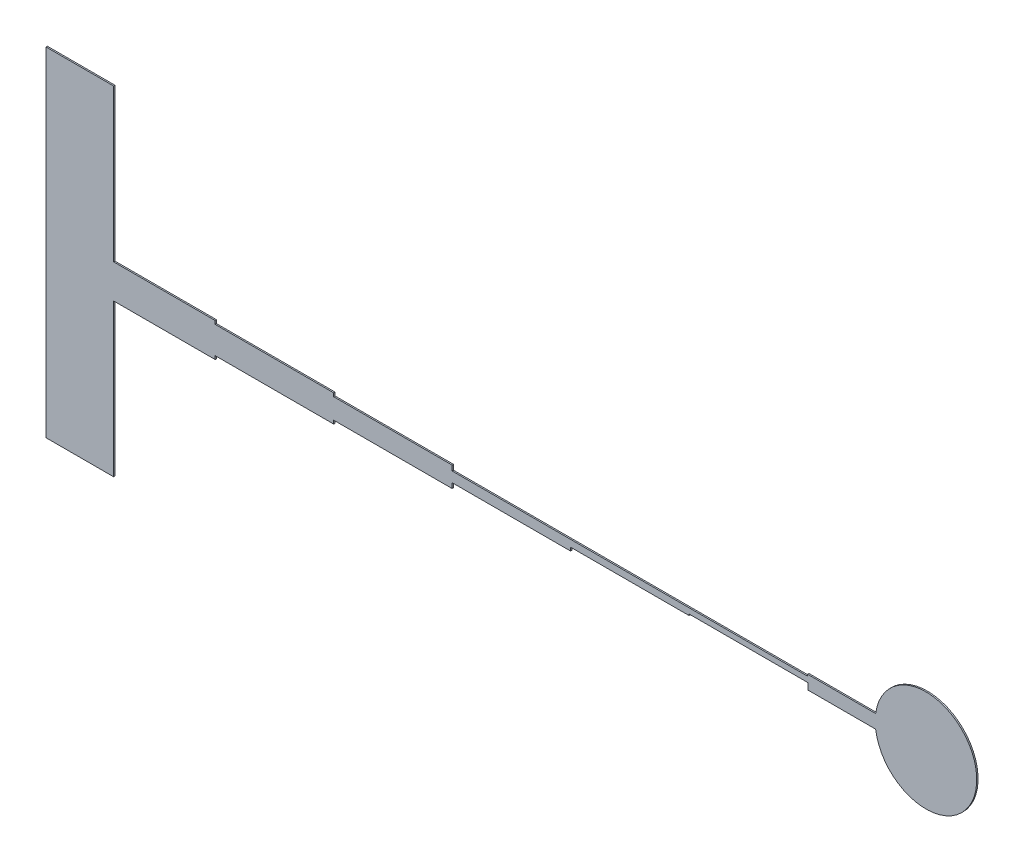
ISO-10303-21;
HEADER;
FILE_DESCRIPTION(('STEP AP214'),'2;1');
FILE_NAME('part.step','',(''),(''),'','','');
FILE_SCHEMA(('AUTOMOTIVE_DESIGN { 1 0 10303 214 1 1 1 1 }'));
ENDSEC;
DATA;
#1=APPLICATION_CONTEXT('core data for automotive mechanical design processes');
#2=APPLICATION_PROTOCOL_DEFINITION('international standard','automotive_design',2000,#1);
#3=PRODUCT_CONTEXT('',#1,'mechanical');
#4=PRODUCT('Part','Part','',(#3));
#5=PRODUCT_RELATED_PRODUCT_CATEGORY('part','',(#4));
#6=PRODUCT_DEFINITION_FORMATION('','',#4);
#7=PRODUCT_DEFINITION_CONTEXT('part definition',#1,'design');
#8=PRODUCT_DEFINITION('design','',#6,#7);
#9=PRODUCT_DEFINITION_SHAPE('','',#8);
#10=(LENGTH_UNIT() NAMED_UNIT(*) SI_UNIT(.MILLI.,.METRE.));
#11=(NAMED_UNIT(*) PLANE_ANGLE_UNIT() SI_UNIT($,.RADIAN.));
#12=(NAMED_UNIT(*) SI_UNIT($,.STERADIAN.) SOLID_ANGLE_UNIT());
#13=UNCERTAINTY_MEASURE_WITH_UNIT(LENGTH_MEASURE(1.E-05),#10,'distance_accuracy_value','');
#14=(GEOMETRIC_REPRESENTATION_CONTEXT(3) GLOBAL_UNCERTAINTY_ASSIGNED_CONTEXT((#13)) GLOBAL_UNIT_ASSIGNED_CONTEXT((#10,
#11,#12)) REPRESENTATION_CONTEXT('',''));
#15=CARTESIAN_POINT('',(0.,0.,0.));
#16=DIRECTION('',(0.,0.,1.));
#17=DIRECTION('',(1.,0.,0.));
#18=AXIS2_PLACEMENT_3D('',#15,#16,#17);
#19=CARTESIAN_POINT('',(12000.,2.44249065417534E-12,-20.));
#20=DIRECTION('',(0.,0.,1.));
#21=DIRECTION('',(1.,0.,0.));
#22=AXIS2_PLACEMENT_3D('',#19,#20,#21);
#23=PLANE('',#22);
#24=DIRECTION('',(-1.,0.,0.));
#25=VECTOR('',#24,1.);
#26=CARTESIAN_POINT('',(8500.,-4.99999999999992,-20.));
#27=LINE('',#26,#25);
#28=CARTESIAN_POINT('',(10259.9128142698,-4.99999999999992,-20.));
#29=VERTEX_POINT('',#28);
#30=CARTESIAN_POINT('',(8500.,-4.99999999999992,-20.));
#31=VERTEX_POINT('',#30);
#32=EDGE_CURVE('E240',#29,#31,#27,.T.);
#33=ORIENTED_EDGE('',*,*,#32,.T.);
#34=DIRECTION('',(0.,-1.,0.));
#35=VECTOR('',#34,1.);
#36=CARTESIAN_POINT('',(8500.,-125.,-20.));
#37=LINE('',#36,#35);
#38=CARTESIAN_POINT('',(8500.,-25.,-20.));
#39=VERTEX_POINT('',#38);
#40=EDGE_CURVE('E253',#31,#39,#37,.T.);
#41=ORIENTED_EDGE('',*,*,#40,.T.);
#42=DIRECTION('',(-1.,0.,0.));
#43=VECTOR('',#42,1.);
#44=CARTESIAN_POINT('',(6750.,-24.9999999999999,-20.));
#45=LINE('',#44,#43);
#46=CARTESIAN_POINT('',(6750.,-24.9999999999999,-20.));
#47=VERTEX_POINT('',#46);
#48=EDGE_CURVE('E284',#39,#47,#45,.T.);
#49=ORIENTED_EDGE('',*,*,#48,.T.);
#50=DIRECTION('',(0.,-1.,0.));
#51=VECTOR('',#50,1.);
#52=CARTESIAN_POINT('',(6750.,-125.,-20.));
#53=LINE('',#52,#51);
#54=CARTESIAN_POINT('',(6750.,-74.9999999999999,-20.));
#55=VERTEX_POINT('',#54);
#56=EDGE_CURVE('E280',#47,#55,#53,.T.);
#57=ORIENTED_EDGE('',*,*,#56,.T.);
#58=DIRECTION('',(1.,0.,0.));
#59=VECTOR('',#58,1.);
#60=CARTESIAN_POINT('',(5000.,-74.9999999999999,-20.));
#61=LINE('',#60,#59);
#62=CARTESIAN_POINT('',(5000.,-74.9999999999999,-20.));
#63=VERTEX_POINT('',#62);
#64=EDGE_CURVE('E302',#63,#55,#61,.T.);
#65=ORIENTED_EDGE('',*,*,#64,.F.);
#66=DIRECTION('',(0.,1.,0.));
#67=VECTOR('',#66,1.);
#68=CARTESIAN_POINT('',(5000.,-124.999999999995,-20.));
#69=LINE('',#68,#67);
#70=CARTESIAN_POINT('',(5000.,-150.,-20.));
#71=VERTEX_POINT('',#70);
#72=EDGE_CURVE('E450',#71,#63,#69,.T.);
#73=ORIENTED_EDGE('',*,*,#72,.F.);
#74=DIRECTION('',(1.,0.,0.));
#75=VECTOR('',#74,1.);
#76=CARTESIAN_POINT('',(3250.,-150.,-20.));
#77=LINE('',#76,#75);
#78=CARTESIAN_POINT('',(3250.,-150.,-20.));
#79=VERTEX_POINT('',#78);
#80=EDGE_CURVE('E383',#79,#71,#77,.T.);
#81=ORIENTED_EDGE('',*,*,#80,.F.);
#82=DIRECTION('',(0.,1.,0.));
#83=VECTOR('',#82,1.);
#84=CARTESIAN_POINT('',(3250.,-200.,-20.));
#85=LINE('',#84,#83);
#86=CARTESIAN_POINT('',(3250.,-200.,-20.));
#87=VERTEX_POINT('',#86);
#88=EDGE_CURVE('E380',#87,#79,#85,.T.);
#89=ORIENTED_EDGE('',*,*,#88,.F.);
#90=DIRECTION('',(1.,0.,0.));
#91=VECTOR('',#90,1.);
#92=CARTESIAN_POINT('',(1500.,-200.,-20.));
#93=LINE('',#92,#91);
#94=CARTESIAN_POINT('',(1500.,-200.,-20.));
#95=VERTEX_POINT('',#94);
#96=EDGE_CURVE('E376',#95,#87,#93,.T.);
#97=ORIENTED_EDGE('',*,*,#96,.F.);
#98=DIRECTION('',(0.,1.,0.));
#99=VECTOR('',#98,1.);
#100=CARTESIAN_POINT('',(1500.,-250.,-20.));
#101=LINE('',#100,#99);
#102=CARTESIAN_POINT('',(1500.,-250.,-20.));
#103=VERTEX_POINT('',#102);
#104=EDGE_CURVE('E373',#103,#95,#101,.T.);
#105=ORIENTED_EDGE('',*,*,#104,.F.);
#106=DIRECTION('',(1.,0.,0.));
#107=VECTOR('',#106,1.);
#108=CARTESIAN_POINT('',(1000.,-250.,-20.));
#109=LINE('',#108,#107);
#110=CARTESIAN_POINT('',(0.,-250.,-20.));
#111=VERTEX_POINT('',#110);
#112=EDGE_CURVE('E446',#111,#103,#109,.T.);
#113=ORIENTED_EDGE('',*,*,#112,.F.);
#114=DIRECTION('',(0.,-1.,0.));
#115=VECTOR('',#114,1.);
#116=CARTESIAN_POINT('',(0.,-2500.,-20.));
#117=LINE('',#116,#115);
#118=CARTESIAN_POINT('',(0.,-2500.,-20.));
#119=VERTEX_POINT('',#118);
#120=EDGE_CURVE('E437',#111,#119,#117,.T.);
#121=ORIENTED_EDGE('',*,*,#120,.T.);
#122=DIRECTION('',(1.,0.,0.));
#123=VECTOR('',#122,1.);
#124=CARTESIAN_POINT('',(-1000.,-2500.,-20.));
#125=LINE('',#124,#123);
#126=CARTESIAN_POINT('',(-1000.,-2500.,-20.));
#127=VERTEX_POINT('',#126);
#128=EDGE_CURVE('E478',#127,#119,#125,.T.);
#129=ORIENTED_EDGE('',*,*,#128,.F.);
#130=DIRECTION('',(0.,-1.,0.));
#131=VECTOR('',#130,1.);
#132=CARTESIAN_POINT('',(-1000.,2500.,-20.));
#133=LINE('',#132,#131);
#134=CARTESIAN_POINT('',(-1000.,2500.,-20.));
#135=VERTEX_POINT('',#134);
#136=EDGE_CURVE('E474',#135,#127,#133,.T.);
#137=ORIENTED_EDGE('',*,*,#136,.F.);
#138=DIRECTION('',(-1.,0.,0.));
#139=VECTOR('',#138,1.);
#140=CARTESIAN_POINT('',(-1000.,2500.,-20.));
#141=LINE('',#140,#139);
#142=CARTESIAN_POINT('',(-4.44089209850063E-13,2500.,-20.));
#143=VERTEX_POINT('',#142);
#144=EDGE_CURVE('E471',#143,#135,#141,.T.);
#145=ORIENTED_EDGE('',*,*,#144,.F.);
#146=DIRECTION('',(0.,-1.,0.));
#147=VECTOR('',#146,1.);
#148=CARTESIAN_POINT('',(-4.44089209850063E-13,2500.,-20.));
#149=LINE('',#148,#147);
#150=CARTESIAN_POINT('',(-2.22044604925031E-13,250.,-20.));
#151=VERTEX_POINT('',#150);
#152=EDGE_CURVE('E416',#143,#151,#149,.T.);
#153=ORIENTED_EDGE('',*,*,#152,.T.);
#154=DIRECTION('',(-1.,0.,0.));
#155=VECTOR('',#154,1.);
#156=CARTESIAN_POINT('',(1000.,250.,-20.));
#157=LINE('',#156,#155);
#158=CARTESIAN_POINT('',(1500.,250.,-20.));
#159=VERTEX_POINT('',#158);
#160=EDGE_CURVE('E468',#159,#151,#157,.T.);
#161=ORIENTED_EDGE('',*,*,#160,.F.);
#162=DIRECTION('',(0.,-1.,0.));
#163=VECTOR('',#162,1.);
#164=CARTESIAN_POINT('',(1500.,250.,-20.));
#165=LINE('',#164,#163);
#166=CARTESIAN_POINT('',(1500.,200.,-20.));
#167=VERTEX_POINT('',#166);
#168=EDGE_CURVE('E328',#159,#167,#165,.T.);
#169=ORIENTED_EDGE('',*,*,#168,.T.);
#170=DIRECTION('',(1.,0.,0.));
#171=VECTOR('',#170,1.);
#172=CARTESIAN_POINT('',(1500.,200.,-20.));
#173=LINE('',#172,#171);
#174=CARTESIAN_POINT('',(3250.,200.,-20.));
#175=VERTEX_POINT('',#174);
#176=EDGE_CURVE('E341',#167,#175,#173,.T.);
#177=ORIENTED_EDGE('',*,*,#176,.T.);
#178=DIRECTION('',(0.,-1.,0.));
#179=VECTOR('',#178,1.);
#180=CARTESIAN_POINT('',(3250.,200.,-20.));
#181=LINE('',#180,#179);
#182=CARTESIAN_POINT('',(3250.,150.,-20.));
#183=VERTEX_POINT('',#182);
#184=EDGE_CURVE('E337',#175,#183,#181,.T.);
#185=ORIENTED_EDGE('',*,*,#184,.T.);
#186=DIRECTION('',(1.,0.,0.));
#187=VECTOR('',#186,1.);
#188=CARTESIAN_POINT('',(3250.,150.,-20.));
#189=LINE('',#188,#187);
#190=CARTESIAN_POINT('',(5000.,150.,-20.));
#191=VERTEX_POINT('',#190);
#192=EDGE_CURVE('E332',#183,#191,#189,.T.);
#193=ORIENTED_EDGE('',*,*,#192,.T.);
#194=DIRECTION('',(0.,1.,0.));
#195=VECTOR('',#194,1.);
#196=CARTESIAN_POINT('',(5000.,250.,-20.));
#197=LINE('',#196,#195);
#198=CARTESIAN_POINT('',(5000.,74.9999999999999,-20.));
#199=VERTEX_POINT('',#198);
#200=EDGE_CURVE('E464',#199,#191,#197,.T.);
#201=ORIENTED_EDGE('',*,*,#200,.F.);
#202=DIRECTION('',(1.,0.,0.));
#203=VECTOR('',#202,1.);
#204=CARTESIAN_POINT('',(5000.,74.9999999999999,-20.));
#205=LINE('',#204,#203);
#206=CARTESIAN_POINT('',(10250.,75.000000000001,-20.));
#207=VERTEX_POINT('',#206);
#208=EDGE_CURVE('E318',#199,#207,#205,.T.);
#209=ORIENTED_EDGE('',*,*,#208,.T.);
#210=DIRECTION('',(0.,1.,0.));
#211=VECTOR('',#210,1.);
#212=CARTESIAN_POINT('',(10250.,125.000000000001,-20.));
#213=LINE('',#212,#211);
#214=CARTESIAN_POINT('',(10250.,100.000000000003,-20.));
#215=VERTEX_POINT('',#214);
#216=EDGE_CURVE('E269',#207,#215,#213,.T.);
#217=ORIENTED_EDGE('',*,*,#216,.T.);
#218=DIRECTION('',(-1.,0.,0.));
#219=VECTOR('',#218,1.);
#220=CARTESIAN_POINT('',(9000.,100.000000000003,-20.));
#221=LINE('',#220,#219);
#222=CARTESIAN_POINT('',(11256.6965626341,100.000000000003,-20.));
#223=VERTEX_POINT('',#222);
#224=EDGE_CURVE('E460',#223,#215,#221,.T.);
#225=ORIENTED_EDGE('',*,*,#224,.F.);
#226=CARTESIAN_POINT('',(12000.,2.44249065417534E-12,-20.));
#227=DIRECTION('',(0.,0.,1.));
#228=DIRECTION('',(1.,0.,0.));
#229=AXIS2_PLACEMENT_3D('',#226,#227,#228);
#230=CIRCLE('',#229,749.999999999999);
#231=CARTESIAN_POINT('',(11256.6965626341,-99.9999999999971,-20.));
#232=VERTEX_POINT('',#231);
#233=EDGE_CURVE('E456',#232,#223,#230,.T.);
#234=ORIENTED_EDGE('',*,*,#233,.F.);
#235=DIRECTION('',(1.,0.,0.));
#236=VECTOR('',#235,1.);
#237=CARTESIAN_POINT('',(9000.,-99.9999999999962,-20.));
#238=LINE('',#237,#236);
#239=CARTESIAN_POINT('',(10259.9128142698,-99.9999999999965,-20.));
#240=VERTEX_POINT('',#239);
#241=EDGE_CURVE('E251',#240,#232,#238,.T.);
#242=ORIENTED_EDGE('',*,*,#241,.F.);
#243=DIRECTION('',(0.,1.,0.));
#244=VECTOR('',#243,1.);
#245=CARTESIAN_POINT('',(10259.9128142698,-125.,-20.));
#246=LINE('',#245,#244);
#247=EDGE_CURVE('E231',#240,#29,#246,.T.);
#248=ORIENTED_EDGE('',*,*,#247,.T.);
#249=EDGE_LOOP('',(#33,#41,#49,#57,#65,#73,#81,#89,#97,#105,#113,#121,#129,#137,#145,#153,#161,
#169,#177,#185,#193,#201,#209,#217,#225,#234,#242,#248));
#250=FACE_BOUND('',#249,.T.);
#251=ADVANCED_FACE('F42',(#250),#23,.F.);
#252=CARTESIAN_POINT('',(12000.,2.44249065417534E-12,0.));
#253=DIRECTION('',(0.,0.,1.));
#254=DIRECTION('',(1.,0.,0.));
#255=AXIS2_PLACEMENT_3D('',#252,#253,#254);
#256=PLANE('',#255);
#257=DIRECTION('',(0.,-1.,0.));
#258=VECTOR('',#257,1.);
#259=CARTESIAN_POINT('',(8500.,-125.,0.));
#260=LINE('',#259,#258);
#261=CARTESIAN_POINT('',(8500.,-4.99999999999992,0.));
#262=VERTEX_POINT('',#261);
#263=CARTESIAN_POINT('',(8500.,-24.9999999999999,0.));
#264=VERTEX_POINT('',#263);
#265=EDGE_CURVE('E259',#262,#264,#260,.T.);
#266=ORIENTED_EDGE('',*,*,#265,.F.);
#267=DIRECTION('',(-1.,0.,0.));
#268=VECTOR('',#267,1.);
#269=CARTESIAN_POINT('',(8500.,-4.99999999999992,0.));
#270=LINE('',#269,#268);
#271=CARTESIAN_POINT('',(10259.9128142698,-4.99999999999992,0.));
#272=VERTEX_POINT('',#271);
#273=EDGE_CURVE('E256',#272,#262,#270,.T.);
#274=ORIENTED_EDGE('',*,*,#273,.F.);
#275=DIRECTION('',(0.,1.,0.));
#276=VECTOR('',#275,1.);
#277=CARTESIAN_POINT('',(10259.9128142698,-125.,0.));
#278=LINE('',#277,#276);
#279=CARTESIAN_POINT('',(10259.9128142698,-99.9999999999965,0.));
#280=VERTEX_POINT('',#279);
#281=EDGE_CURVE('E234',#280,#272,#278,.T.);
#282=ORIENTED_EDGE('',*,*,#281,.F.);
#283=DIRECTION('',(1.,0.,0.));
#284=VECTOR('',#283,1.);
#285=CARTESIAN_POINT('',(9000.,-99.9999999999962,0.));
#286=LINE('',#285,#284);
#287=CARTESIAN_POINT('',(11256.6965626341,-99.9999999999971,0.));
#288=VERTEX_POINT('',#287);
#289=EDGE_CURVE('E489',#280,#288,#286,.T.);
#290=ORIENTED_EDGE('',*,*,#289,.T.);
#291=CARTESIAN_POINT('',(12000.,2.44249065417534E-12,0.));
#292=DIRECTION('',(0.,0.,1.));
#293=DIRECTION('',(1.,0.,0.));
#294=AXIS2_PLACEMENT_3D('',#291,#292,#293);
#295=CIRCLE('',#294,749.999999999999);
#296=CARTESIAN_POINT('',(11256.6965626341,100.000000000003,0.));
#297=VERTEX_POINT('',#296);
#298=EDGE_CURVE('E492',#288,#297,#295,.T.);
#299=ORIENTED_EDGE('',*,*,#298,.T.);
#300=DIRECTION('',(-1.,0.,0.));
#301=VECTOR('',#300,1.);
#302=CARTESIAN_POINT('',(9000.,100.000000000003,0.));
#303=LINE('',#302,#301);
#304=CARTESIAN_POINT('',(10250.,100.000000000003,0.));
#305=VERTEX_POINT('',#304);
#306=EDGE_CURVE('E496',#297,#305,#303,.T.);
#307=ORIENTED_EDGE('',*,*,#306,.T.);
#308=DIRECTION('',(0.,1.,0.));
#309=VECTOR('',#308,1.);
#310=CARTESIAN_POINT('',(10250.,125.000000000001,0.));
#311=LINE('',#310,#309);
#312=CARTESIAN_POINT('',(10250.,75.000000000001,0.));
#313=VERTEX_POINT('',#312);
#314=EDGE_CURVE('E267',#313,#305,#311,.T.);
#315=ORIENTED_EDGE('',*,*,#314,.F.);
#316=DIRECTION('',(1.,0.,0.));
#317=VECTOR('',#316,1.);
#318=CARTESIAN_POINT('',(5000.,74.9999999999999,0.));
#319=LINE('',#318,#317);
#320=CARTESIAN_POINT('',(5000.,74.9999999999999,0.));
#321=VERTEX_POINT('',#320);
#322=EDGE_CURVE('E314',#321,#313,#319,.T.);
#323=ORIENTED_EDGE('',*,*,#322,.F.);
#324=DIRECTION('',(0.,1.,0.));
#325=VECTOR('',#324,1.);
#326=CARTESIAN_POINT('',(5000.,250.,0.));
#327=LINE('',#326,#325);
#328=CARTESIAN_POINT('',(5000.,150.,0.));
#329=VERTEX_POINT('',#328);
#330=EDGE_CURVE('E500',#321,#329,#327,.T.);
#331=ORIENTED_EDGE('',*,*,#330,.T.);
#332=DIRECTION('',(1.,0.,0.));
#333=VECTOR('',#332,1.);
#334=CARTESIAN_POINT('',(3250.,150.,0.));
#335=LINE('',#334,#333);
#336=CARTESIAN_POINT('',(3250.,150.,0.));
#337=VERTEX_POINT('',#336);
#338=EDGE_CURVE('E58',#337,#329,#335,.T.);
#339=ORIENTED_EDGE('',*,*,#338,.F.);
#340=DIRECTION('',(0.,-1.,0.));
#341=VECTOR('',#340,1.);
#342=CARTESIAN_POINT('',(3250.,200.,0.));
#343=LINE('',#342,#341);
#344=CARTESIAN_POINT('',(3250.,200.,0.));
#345=VERTEX_POINT('',#344);
#346=EDGE_CURVE('E351',#345,#337,#343,.T.);
#347=ORIENTED_EDGE('',*,*,#346,.F.);
#348=DIRECTION('',(1.,0.,0.));
#349=VECTOR('',#348,1.);
#350=CARTESIAN_POINT('',(1500.,200.,0.));
#351=LINE('',#350,#349);
#352=CARTESIAN_POINT('',(1500.,200.,0.));
#353=VERTEX_POINT('',#352);
#354=EDGE_CURVE('E333',#353,#345,#351,.T.);
#355=ORIENTED_EDGE('',*,*,#354,.F.);
#356=DIRECTION('',(0.,-1.,0.));
#357=VECTOR('',#356,1.);
#358=CARTESIAN_POINT('',(1500.,250.,0.));
#359=LINE('',#358,#357);
#360=CARTESIAN_POINT('',(1500.,250.,0.));
#361=VERTEX_POINT('',#360);
#362=EDGE_CURVE('E327',#361,#353,#359,.T.);
#363=ORIENTED_EDGE('',*,*,#362,.F.);
#364=DIRECTION('',(-1.,0.,0.));
#365=VECTOR('',#364,1.);
#366=CARTESIAN_POINT('',(1000.,250.,0.));
#367=LINE('',#366,#365);
#368=CARTESIAN_POINT('',(-2.22044604925031E-13,250.,0.));
#369=VERTEX_POINT('',#368);
#370=EDGE_CURVE('E504',#361,#369,#367,.T.);
#371=ORIENTED_EDGE('',*,*,#370,.T.);
#372=DIRECTION('',(0.,-1.,0.));
#373=VECTOR('',#372,1.);
#374=CARTESIAN_POINT('',(-4.44089209850063E-13,2500.,0.));
#375=LINE('',#374,#373);
#376=CARTESIAN_POINT('',(0.,2500.,0.));
#377=VERTEX_POINT('',#376);
#378=EDGE_CURVE('E421',#377,#369,#375,.T.);
#379=ORIENTED_EDGE('',*,*,#378,.F.);
#380=DIRECTION('',(-1.,0.,0.));
#381=VECTOR('',#380,1.);
#382=CARTESIAN_POINT('',(-1000.,2500.,0.));
#383=LINE('',#382,#381);
#384=CARTESIAN_POINT('',(-1000.,2500.,0.));
#385=VERTEX_POINT('',#384);
#386=EDGE_CURVE('E507',#377,#385,#383,.T.);
#387=ORIENTED_EDGE('',*,*,#386,.T.);
#388=DIRECTION('',(0.,-1.,0.));
#389=VECTOR('',#388,1.);
#390=CARTESIAN_POINT('',(-1000.,2500.,0.));
#391=LINE('',#390,#389);
#392=CARTESIAN_POINT('',(-1000.,-2500.,0.));
#393=VERTEX_POINT('',#392);
#394=EDGE_CURVE('E510',#385,#393,#391,.T.);
#395=ORIENTED_EDGE('',*,*,#394,.T.);
#396=DIRECTION('',(1.,0.,0.));
#397=VECTOR('',#396,1.);
#398=CARTESIAN_POINT('',(-1000.,-2500.,0.));
#399=LINE('',#398,#397);
#400=CARTESIAN_POINT('',(0.,-2500.,0.));
#401=VERTEX_POINT('',#400);
#402=EDGE_CURVE('E451',#393,#401,#399,.T.);
#403=ORIENTED_EDGE('',*,*,#402,.T.);
#404=DIRECTION('',(0.,-1.,0.));
#405=VECTOR('',#404,1.);
#406=CARTESIAN_POINT('',(0.,-2500.,0.));
#407=LINE('',#406,#405);
#408=CARTESIAN_POINT('',(0.,-250.,0.));
#409=VERTEX_POINT('',#408);
#410=EDGE_CURVE('E425',#409,#401,#407,.T.);
#411=ORIENTED_EDGE('',*,*,#410,.F.);
#412=DIRECTION('',(1.,0.,0.));
#413=VECTOR('',#412,1.);
#414=CARTESIAN_POINT('',(1000.,-250.,0.));
#415=LINE('',#414,#413);
#416=CARTESIAN_POINT('',(1500.,-250.,0.));
#417=VERTEX_POINT('',#416);
#418=EDGE_CURVE('E430',#409,#417,#415,.T.);
#419=ORIENTED_EDGE('',*,*,#418,.T.);
#420=DIRECTION('',(0.,1.,0.));
#421=VECTOR('',#420,1.);
#422=CARTESIAN_POINT('',(1500.,-250.,0.));
#423=LINE('',#422,#421);
#424=CARTESIAN_POINT('',(1500.,-200.,0.));
#425=VERTEX_POINT('',#424);
#426=EDGE_CURVE('E372',#417,#425,#423,.T.);
#427=ORIENTED_EDGE('',*,*,#426,.T.);
#428=DIRECTION('',(1.,0.,0.));
#429=VECTOR('',#428,1.);
#430=CARTESIAN_POINT('',(1500.,-200.,0.));
#431=LINE('',#430,#429);
#432=CARTESIAN_POINT('',(3250.,-200.,0.));
#433=VERTEX_POINT('',#432);
#434=EDGE_CURVE('E390',#425,#433,#431,.T.);
#435=ORIENTED_EDGE('',*,*,#434,.T.);
#436=DIRECTION('',(0.,1.,0.));
#437=VECTOR('',#436,1.);
#438=CARTESIAN_POINT('',(3250.,-200.,0.));
#439=LINE('',#438,#437);
#440=CARTESIAN_POINT('',(3250.,-150.,0.));
#441=VERTEX_POINT('',#440);
#442=EDGE_CURVE('E394',#433,#441,#439,.T.);
#443=ORIENTED_EDGE('',*,*,#442,.T.);
#444=DIRECTION('',(1.,0.,0.));
#445=VECTOR('',#444,1.);
#446=CARTESIAN_POINT('',(3250.,-150.,0.));
#447=LINE('',#446,#445);
#448=CARTESIAN_POINT('',(5000.,-150.,0.));
#449=VERTEX_POINT('',#448);
#450=EDGE_CURVE('E377',#441,#449,#447,.T.);
#451=ORIENTED_EDGE('',*,*,#450,.T.);
#452=DIRECTION('',(0.,1.,0.));
#453=VECTOR('',#452,1.);
#454=CARTESIAN_POINT('',(5000.,-124.999999999995,0.));
#455=LINE('',#454,#453);
#456=CARTESIAN_POINT('',(5000.,-74.9999999999999,0.));
#457=VERTEX_POINT('',#456);
#458=EDGE_CURVE('E486',#449,#457,#455,.T.);
#459=ORIENTED_EDGE('',*,*,#458,.T.);
#460=DIRECTION('',(1.,0.,0.));
#461=VECTOR('',#460,1.);
#462=CARTESIAN_POINT('',(5000.,-74.9999999999999,0.));
#463=LINE('',#462,#461);
#464=CARTESIAN_POINT('',(6750.,-74.9999999999999,0.));
#465=VERTEX_POINT('',#464);
#466=EDGE_CURVE('E298',#457,#465,#463,.T.);
#467=ORIENTED_EDGE('',*,*,#466,.T.);
#468=DIRECTION('',(0.,-1.,0.));
#469=VECTOR('',#468,1.);
#470=CARTESIAN_POINT('',(6750.,-125.,0.));
#471=LINE('',#470,#469);
#472=CARTESIAN_POINT('',(6750.,-24.9999999999999,0.));
#473=VERTEX_POINT('',#472);
#474=EDGE_CURVE('E279',#473,#465,#471,.T.);
#475=ORIENTED_EDGE('',*,*,#474,.F.);
#476=DIRECTION('',(-1.,0.,0.));
#477=VECTOR('',#476,1.);
#478=CARTESIAN_POINT('',(6750.,-24.9999999999999,0.));
#479=LINE('',#478,#477);
#480=EDGE_CURVE('E285',#264,#473,#479,.T.);
#481=ORIENTED_EDGE('',*,*,#480,.F.);
#482=EDGE_LOOP('',(#266,#274,#282,#290,#299,#307,#315,#323,#331,#339,#347,#355,#363,#371,#379,
#387,#395,#403,#411,#419,#427,#435,#443,#451,#459,#467,#475,#481));
#483=FACE_BOUND('',#482,.T.);
#484=ADVANCED_FACE('F550',(#483),#256,.T.);
#485=CARTESIAN_POINT('',(5000.,-124.999999999995,-20.));
#486=DIRECTION('',(1.,0.,0.));
#487=DIRECTION('',(0.,0.,-1.));
#488=AXIS2_PLACEMENT_3D('',#485,#486,#487);
#489=PLANE('',#488);
#490=ORIENTED_EDGE('',*,*,#458,.F.);
#491=DIRECTION('',(0.,0.,1.));
#492=VECTOR('',#491,1.);
#493=CARTESIAN_POINT('',(5000.,-150.,-20.));
#494=LINE('',#493,#492);
#495=EDGE_CURVE('E66',#71,#449,#494,.T.);
#496=ORIENTED_EDGE('',*,*,#495,.F.);
#497=ORIENTED_EDGE('',*,*,#72,.T.);
#498=DIRECTION('',(0.,0.,1.));
#499=VECTOR('',#498,1.);
#500=CARTESIAN_POINT('',(5000.,-74.9999999999999,-20.));
#501=LINE('',#500,#499);
#502=EDGE_CURVE('E310',#63,#457,#501,.T.);
#503=ORIENTED_EDGE('',*,*,#502,.T.);
#504=EDGE_LOOP('',(#490,#496,#497,#503));
#505=FACE_BOUND('',#504,.T.);
#506=ADVANCED_FACE('F568',(#505),#489,.T.);
#507=CARTESIAN_POINT('',(1000.,-250.,-20.));
#508=DIRECTION('',(0.,-1.,0.));
#509=DIRECTION('',(1.,0.,0.));
#510=AXIS2_PLACEMENT_3D('',#507,#508,#509);
#511=PLANE('',#510);
#512=ORIENTED_EDGE('',*,*,#112,.T.);
#513=DIRECTION('',(0.,0.,1.));
#514=VECTOR('',#513,1.);
#515=CARTESIAN_POINT('',(1500.,-250.,-20.));
#516=LINE('',#515,#514);
#517=EDGE_CURVE('E386',#103,#417,#516,.T.);
#518=ORIENTED_EDGE('',*,*,#517,.T.);
#519=ORIENTED_EDGE('',*,*,#418,.F.);
#520=DIRECTION('',(0.,0.,1.));
#521=VECTOR('',#520,1.);
#522=CARTESIAN_POINT('',(0.,-250.,-20.));
#523=LINE('',#522,#521);
#524=EDGE_CURVE('E433',#111,#409,#523,.T.);
#525=ORIENTED_EDGE('',*,*,#524,.F.);
#526=EDGE_LOOP('',(#512,#518,#519,#525));
#527=FACE_BOUND('',#526,.T.);
#528=ADVANCED_FACE('F44',(#527),#511,.T.);
#529=CARTESIAN_POINT('',(-1000.,-2500.,-20.));
#530=DIRECTION('',(0.,-1.,0.));
#531=DIRECTION('',(0.,0.,-1.));
#532=AXIS2_PLACEMENT_3D('',#529,#530,#531);
#533=PLANE('',#532);
#534=DIRECTION('',(0.,0.,1.));
#535=VECTOR('',#534,1.);
#536=CARTESIAN_POINT('',(0.,-2500.,-20.));
#537=LINE('',#536,#535);
#538=EDGE_CURVE('E415',#119,#401,#537,.T.);
#539=ORIENTED_EDGE('',*,*,#538,.T.);
#540=ORIENTED_EDGE('',*,*,#402,.F.);
#541=DIRECTION('',(0.,0.,1.));
#542=VECTOR('',#541,1.);
#543=CARTESIAN_POINT('',(-1000.,-2500.,-20.));
#544=LINE('',#543,#542);
#545=EDGE_CURVE('E517',#127,#393,#544,.T.);
#546=ORIENTED_EDGE('',*,*,#545,.F.);
#547=ORIENTED_EDGE('',*,*,#128,.T.);
#548=EDGE_LOOP('',(#539,#540,#546,#547));
#549=FACE_BOUND('',#548,.T.);
#550=ADVANCED_FACE('F592',(#549),#533,.T.);
#551=CARTESIAN_POINT('',(-1000.,2500.,-20.));
#552=DIRECTION('',(-1.,0.,0.));
#553=DIRECTION('',(0.,-1.,0.));
#554=AXIS2_PLACEMENT_3D('',#551,#552,#553);
#555=PLANE('',#554);
#556=ORIENTED_EDGE('',*,*,#394,.F.);
#557=DIRECTION('',(0.,0.,1.));
#558=VECTOR('',#557,1.);
#559=CARTESIAN_POINT('',(-1000.,2500.,-20.));
#560=LINE('',#559,#558);
#561=EDGE_CURVE('E520',#135,#385,#560,.T.);
#562=ORIENTED_EDGE('',*,*,#561,.F.);
#563=ORIENTED_EDGE('',*,*,#136,.T.);
#564=ORIENTED_EDGE('',*,*,#545,.T.);
#565=EDGE_LOOP('',(#556,#562,#563,#564));
#566=FACE_BOUND('',#565,.T.);
#567=ADVANCED_FACE('F597',(#566),#555,.T.);
#568=CARTESIAN_POINT('',(-1000.,2500.,-20.));
#569=DIRECTION('',(0.,1.,0.));
#570=DIRECTION('',(0.,0.,1.));
#571=AXIS2_PLACEMENT_3D('',#568,#569,#570);
#572=PLANE('',#571);
#573=DIRECTION('',(0.,0.,1.));
#574=VECTOR('',#573,1.);
#575=CARTESIAN_POINT('',(-4.44089209850063E-13,2500.,-20.));
#576=LINE('',#575,#574);
#577=EDGE_CURVE('E420',#143,#377,#576,.T.);
#578=ORIENTED_EDGE('',*,*,#577,.F.);
#579=ORIENTED_EDGE('',*,*,#144,.T.);
#580=ORIENTED_EDGE('',*,*,#561,.T.);
#581=ORIENTED_EDGE('',*,*,#386,.F.);
#582=EDGE_LOOP('',(#578,#579,#580,#581));
#583=FACE_BOUND('',#582,.T.);
#584=ADVANCED_FACE('F602',(#583),#572,.T.);
#585=CARTESIAN_POINT('',(1000.,250.,-20.));
#586=DIRECTION('',(0.,1.,0.));
#587=DIRECTION('',(0.,0.,1.));
#588=AXIS2_PLACEMENT_3D('',#585,#586,#587);
#589=PLANE('',#588);
#590=DIRECTION('',(0.,0.,1.));
#591=VECTOR('',#590,1.);
#592=CARTESIAN_POINT('',(1500.,250.,-20.));
#593=LINE('',#592,#591);
#594=EDGE_CURVE('E369',#159,#361,#593,.T.);
#595=ORIENTED_EDGE('',*,*,#594,.F.);
#596=ORIENTED_EDGE('',*,*,#160,.T.);
#597=DIRECTION('',(0.,0.,1.));
#598=VECTOR('',#597,1.);
#599=CARTESIAN_POINT('',(-2.22044604925031E-13,250.,-20.));
#600=LINE('',#599,#598);
#601=EDGE_CURVE('E426',#151,#369,#600,.T.);
#602=ORIENTED_EDGE('',*,*,#601,.T.);
#603=ORIENTED_EDGE('',*,*,#370,.F.);
#604=EDGE_LOOP('',(#595,#596,#602,#603));
#605=FACE_BOUND('',#604,.T.);
#606=ADVANCED_FACE('F613',(#605),#589,.T.);
#607=CARTESIAN_POINT('',(5000.,250.,-20.));
#608=DIRECTION('',(1.,0.,0.));
#609=DIRECTION('',(0.,0.,-1.));
#610=AXIS2_PLACEMENT_3D('',#607,#608,#609);
#611=PLANE('',#610);
#612=DIRECTION('',(0.,0.,1.));
#613=VECTOR('',#612,1.);
#614=CARTESIAN_POINT('',(5000.,150.,-20.));
#615=LINE('',#614,#613);
#616=EDGE_CURVE('E366',#191,#329,#615,.T.);
#617=ORIENTED_EDGE('',*,*,#616,.T.);
#618=ORIENTED_EDGE('',*,*,#330,.F.);
#619=DIRECTION('',(0.,0.,1.));
#620=VECTOR('',#619,1.);
#621=CARTESIAN_POINT('',(5000.,74.9999999999999,-20.));
#622=LINE('',#621,#620);
#623=EDGE_CURVE('E321',#199,#321,#622,.T.);
#624=ORIENTED_EDGE('',*,*,#623,.F.);
#625=ORIENTED_EDGE('',*,*,#200,.T.);
#626=EDGE_LOOP('',(#617,#618,#624,#625));
#627=FACE_BOUND('',#626,.T.);
#628=ADVANCED_FACE('F626',(#627),#611,.T.);
#629=CARTESIAN_POINT('',(9000.,100.000000000003,-20.));
#630=DIRECTION('',(0.,1.,0.));
#631=DIRECTION('',(-1.,0.,0.));
#632=AXIS2_PLACEMENT_3D('',#629,#630,#631);
#633=PLANE('',#632);
#634=DIRECTION('',(0.,0.,-1.));
#635=VECTOR('',#634,1.);
#636=CARTESIAN_POINT('',(10250.,100.000000000003,-20.));
#637=LINE('',#636,#635);
#638=EDGE_CURVE('E51',#305,#215,#637,.T.);
#639=ORIENTED_EDGE('',*,*,#638,.F.);
#640=ORIENTED_EDGE('',*,*,#306,.F.);
#641=DIRECTION('',(0.,0.,1.));
#642=VECTOR('',#641,1.);
#643=CARTESIAN_POINT('',(11256.6965626341,100.000000000003,-20.));
#644=LINE('',#643,#642);
#645=EDGE_CURVE('E524',#223,#297,#644,.T.);
#646=ORIENTED_EDGE('',*,*,#645,.F.);
#647=ORIENTED_EDGE('',*,*,#224,.T.);
#648=EDGE_LOOP('',(#639,#640,#646,#647));
#649=FACE_BOUND('',#648,.T.);
#650=ADVANCED_FACE('F540',(#649),#633,.T.);
#651=CARTESIAN_POINT('',(12000.,2.44249065417534E-12,-20.));
#652=DIRECTION('',(0.,0.,1.));
#653=DIRECTION('',(1.,0.,0.));
#654=AXIS2_PLACEMENT_3D('',#651,#652,#653);
#655=CYLINDRICAL_SURFACE('',#654,749.999999999999);
#656=ORIENTED_EDGE('',*,*,#298,.F.);
#657=DIRECTION('',(0.,0.,1.));
#658=VECTOR('',#657,1.);
#659=CARTESIAN_POINT('',(11256.6965626341,-99.9999999999971,-20.));
#660=LINE('',#659,#658);
#661=EDGE_CURVE('E482',#232,#288,#660,.T.);
#662=ORIENTED_EDGE('',*,*,#661,.F.);
#663=ORIENTED_EDGE('',*,*,#233,.T.);
#664=ORIENTED_EDGE('',*,*,#645,.T.);
#665=EDGE_LOOP('',(#656,#662,#663,#664));
#666=FACE_BOUND('',#665,.T.);
#667=ADVANCED_FACE('F543',(#666),#655,.T.);
#668=CARTESIAN_POINT('',(9000.,-99.9999999999962,-20.));
#669=DIRECTION('',(0.,-1.,0.));
#670=DIRECTION('',(1.,0.,0.));
#671=AXIS2_PLACEMENT_3D('',#668,#669,#670);
#672=PLANE('',#671);
#673=DIRECTION('',(0.,0.,1.));
#674=VECTOR('',#673,1.);
#675=CARTESIAN_POINT('',(10259.9128142698,-99.9999999999968,-20.));
#676=LINE('',#675,#674);
#677=EDGE_CURVE('E11',#240,#280,#676,.T.);
#678=ORIENTED_EDGE('',*,*,#677,.F.);
#679=ORIENTED_EDGE('',*,*,#241,.T.);
#680=ORIENTED_EDGE('',*,*,#661,.T.);
#681=ORIENTED_EDGE('',*,*,#289,.F.);
#682=EDGE_LOOP('',(#678,#679,#680,#681));
#683=FACE_BOUND('',#682,.T.);
#684=ADVANCED_FACE('F547',(#683),#672,.T.);
#685=CARTESIAN_POINT('',(0.,-2500.,-20.));
#686=DIRECTION('',(-1.,0.,0.));
#687=DIRECTION('',(0.,0.,1.));
#688=AXIS2_PLACEMENT_3D('',#685,#686,#687);
#689=PLANE('',#688);
#690=ORIENTED_EDGE('',*,*,#410,.T.);
#691=ORIENTED_EDGE('',*,*,#538,.F.);
#692=ORIENTED_EDGE('',*,*,#120,.F.);
#693=ORIENTED_EDGE('',*,*,#524,.T.);
#694=EDGE_LOOP('',(#690,#691,#692,#693));
#695=FACE_BOUND('',#694,.T.);
#696=ADVANCED_FACE('F588',(#695),#689,.F.);
#697=CARTESIAN_POINT('',(-4.44089209850063E-13,2500.,-20.));
#698=DIRECTION('',(-1.,0.,0.));
#699=DIRECTION('',(0.,-1.,0.));
#700=AXIS2_PLACEMENT_3D('',#697,#698,#699);
#701=PLANE('',#700);
#702=ORIENTED_EDGE('',*,*,#378,.T.);
#703=ORIENTED_EDGE('',*,*,#601,.F.);
#704=ORIENTED_EDGE('',*,*,#152,.F.);
#705=ORIENTED_EDGE('',*,*,#577,.T.);
#706=EDGE_LOOP('',(#702,#703,#704,#705));
#707=FACE_BOUND('',#706,.T.);
#708=ADVANCED_FACE('F606',(#707),#701,.F.);
#709=CARTESIAN_POINT('',(1500.,-250.,-20.));
#710=DIRECTION('',(1.,0.,0.));
#711=DIRECTION('',(0.,0.,-1.));
#712=AXIS2_PLACEMENT_3D('',#709,#710,#711);
#713=PLANE('',#712);
#714=ORIENTED_EDGE('',*,*,#426,.F.);
#715=ORIENTED_EDGE('',*,*,#517,.F.);
#716=ORIENTED_EDGE('',*,*,#104,.T.);
#717=DIRECTION('',(0.,0.,1.));
#718=VECTOR('',#717,1.);
#719=CARTESIAN_POINT('',(1500.,-200.,-20.));
#720=LINE('',#719,#718);
#721=EDGE_CURVE('E411',#95,#425,#720,.T.);
#722=ORIENTED_EDGE('',*,*,#721,.T.);
#723=EDGE_LOOP('',(#714,#715,#716,#722));
#724=FACE_BOUND('',#723,.T.);
#725=ADVANCED_FACE('F719',(#724),#713,.T.);
#726=CARTESIAN_POINT('',(1500.,-200.,-20.));
#727=DIRECTION('',(0.,-1.,0.));
#728=DIRECTION('',(0.,0.,-1.));
#729=AXIS2_PLACEMENT_3D('',#726,#727,#728);
#730=PLANE('',#729);
#731=ORIENTED_EDGE('',*,*,#434,.F.);
#732=ORIENTED_EDGE('',*,*,#721,.F.);
#733=ORIENTED_EDGE('',*,*,#96,.T.);
#734=DIRECTION('',(0.,0.,1.));
#735=VECTOR('',#734,1.);
#736=CARTESIAN_POINT('',(3250.,-200.,-20.));
#737=LINE('',#736,#735);
#738=EDGE_CURVE('E408',#87,#433,#737,.T.);
#739=ORIENTED_EDGE('',*,*,#738,.T.);
#740=EDGE_LOOP('',(#731,#732,#733,#739));
#741=FACE_BOUND('',#740,.T.);
#742=ADVANCED_FACE('F579',(#741),#730,.T.);
#743=CARTESIAN_POINT('',(3250.,-200.,-20.));
#744=DIRECTION('',(1.,0.,0.));
#745=DIRECTION('',(0.,0.,-1.));
#746=AXIS2_PLACEMENT_3D('',#743,#744,#745);
#747=PLANE('',#746);
#748=ORIENTED_EDGE('',*,*,#442,.F.);
#749=ORIENTED_EDGE('',*,*,#738,.F.);
#750=ORIENTED_EDGE('',*,*,#88,.T.);
#751=DIRECTION('',(0.,0.,1.));
#752=VECTOR('',#751,1.);
#753=CARTESIAN_POINT('',(3250.,-150.,-20.));
#754=LINE('',#753,#752);
#755=EDGE_CURVE('E405',#79,#441,#754,.T.);
#756=ORIENTED_EDGE('',*,*,#755,.T.);
#757=EDGE_LOOP('',(#748,#749,#750,#756));
#758=FACE_BOUND('',#757,.T.);
#759=ADVANCED_FACE('F576',(#758),#747,.T.);
#760=CARTESIAN_POINT('',(3250.,-150.,-20.));
#761=DIRECTION('',(0.,-1.,0.));
#762=DIRECTION('',(0.,0.,-1.));
#763=AXIS2_PLACEMENT_3D('',#760,#761,#762);
#764=PLANE('',#763);
#765=ORIENTED_EDGE('',*,*,#450,.F.);
#766=ORIENTED_EDGE('',*,*,#755,.F.);
#767=ORIENTED_EDGE('',*,*,#80,.T.);
#768=ORIENTED_EDGE('',*,*,#495,.T.);
#769=EDGE_LOOP('',(#765,#766,#767,#768));
#770=FACE_BOUND('',#769,.T.);
#771=ADVANCED_FACE('F573',(#770),#764,.T.);
#772=CARTESIAN_POINT('',(1500.,250.,-20.));
#773=DIRECTION('',(-1.,0.,0.));
#774=DIRECTION('',(0.,0.,1.));
#775=AXIS2_PLACEMENT_3D('',#772,#773,#774);
#776=PLANE('',#775);
#777=ORIENTED_EDGE('',*,*,#362,.T.);
#778=DIRECTION('',(0.,0.,1.));
#779=VECTOR('',#778,1.);
#780=CARTESIAN_POINT('',(1500.,200.,-20.));
#781=LINE('',#780,#779);
#782=EDGE_CURVE('E345',#167,#353,#781,.T.);
#783=ORIENTED_EDGE('',*,*,#782,.F.);
#784=ORIENTED_EDGE('',*,*,#168,.F.);
#785=ORIENTED_EDGE('',*,*,#594,.T.);
#786=EDGE_LOOP('',(#777,#783,#784,#785));
#787=FACE_BOUND('',#786,.T.);
#788=ADVANCED_FACE('F616',(#787),#776,.F.);
#789=CARTESIAN_POINT('',(3250.,150.,-20.));
#790=DIRECTION('',(0.,-1.,0.));
#791=DIRECTION('',(0.,0.,-1.));
#792=AXIS2_PLACEMENT_3D('',#789,#790,#791);
#793=PLANE('',#792);
#794=ORIENTED_EDGE('',*,*,#338,.T.);
#795=ORIENTED_EDGE('',*,*,#616,.F.);
#796=ORIENTED_EDGE('',*,*,#192,.F.);
#797=DIRECTION('',(0.,0.,1.));
#798=VECTOR('',#797,1.);
#799=CARTESIAN_POINT('',(3250.,150.,-20.));
#800=LINE('',#799,#798);
#801=EDGE_CURVE('E363',#183,#337,#800,.T.);
#802=ORIENTED_EDGE('',*,*,#801,.T.);
#803=EDGE_LOOP('',(#794,#795,#796,#802));
#804=FACE_BOUND('',#803,.T.);
#805=ADVANCED_FACE('F746',(#804),#793,.F.);
#806=CARTESIAN_POINT('',(3250.,200.,-20.));
#807=DIRECTION('',(-1.,0.,0.));
#808=DIRECTION('',(0.,0.,1.));
#809=AXIS2_PLACEMENT_3D('',#806,#807,#808);
#810=PLANE('',#809);
#811=ORIENTED_EDGE('',*,*,#346,.T.);
#812=ORIENTED_EDGE('',*,*,#801,.F.);
#813=ORIENTED_EDGE('',*,*,#184,.F.);
#814=DIRECTION('',(0.,0.,1.));
#815=VECTOR('',#814,1.);
#816=CARTESIAN_POINT('',(3250.,200.,-20.));
#817=LINE('',#816,#815);
#818=EDGE_CURVE('E360',#175,#345,#817,.T.);
#819=ORIENTED_EDGE('',*,*,#818,.T.);
#820=EDGE_LOOP('',(#811,#812,#813,#819));
#821=FACE_BOUND('',#820,.T.);
#822=ADVANCED_FACE('F622',(#821),#810,.F.);
#823=CARTESIAN_POINT('',(1500.,200.,-20.));
#824=DIRECTION('',(0.,-1.,0.));
#825=DIRECTION('',(0.,0.,-1.));
#826=AXIS2_PLACEMENT_3D('',#823,#824,#825);
#827=PLANE('',#826);
#828=ORIENTED_EDGE('',*,*,#354,.T.);
#829=ORIENTED_EDGE('',*,*,#818,.F.);
#830=ORIENTED_EDGE('',*,*,#176,.F.);
#831=ORIENTED_EDGE('',*,*,#782,.T.);
#832=EDGE_LOOP('',(#828,#829,#830,#831));
#833=FACE_BOUND('',#832,.T.);
#834=ADVANCED_FACE('F618',(#833),#827,.F.);
#835=CARTESIAN_POINT('',(5000.,74.9999999999999,-20.));
#836=DIRECTION('',(0.,-1.,0.));
#837=DIRECTION('',(0.,0.,-1.));
#838=AXIS2_PLACEMENT_3D('',#835,#836,#837);
#839=PLANE('',#838);
#840=ORIENTED_EDGE('',*,*,#322,.T.);
#841=DIRECTION('',(0.,0.,1.));
#842=VECTOR('',#841,1.);
#843=CARTESIAN_POINT('',(10250.,75.000000000001,-20.));
#844=LINE('',#843,#842);
#845=EDGE_CURVE('E273',#207,#313,#844,.T.);
#846=ORIENTED_EDGE('',*,*,#845,.F.);
#847=ORIENTED_EDGE('',*,*,#208,.F.);
#848=ORIENTED_EDGE('',*,*,#623,.T.);
#849=EDGE_LOOP('',(#840,#846,#847,#848));
#850=FACE_BOUND('',#849,.T.);
#851=ADVANCED_FACE('F629',(#850),#839,.F.);
#852=CARTESIAN_POINT('',(5000.,-74.9999999999999,-20.));
#853=DIRECTION('',(0.,-1.,0.));
#854=DIRECTION('',(0.,0.,-1.));
#855=AXIS2_PLACEMENT_3D('',#852,#853,#854);
#856=PLANE('',#855);
#857=ORIENTED_EDGE('',*,*,#466,.F.);
#858=ORIENTED_EDGE('',*,*,#502,.F.);
#859=ORIENTED_EDGE('',*,*,#64,.T.);
#860=DIRECTION('',(0.,0.,1.));
#861=VECTOR('',#860,1.);
#862=CARTESIAN_POINT('',(6750.,-74.9999999999999,-20.));
#863=LINE('',#862,#861);
#864=EDGE_CURVE('E306',#55,#465,#863,.T.);
#865=ORIENTED_EDGE('',*,*,#864,.T.);
#866=EDGE_LOOP('',(#857,#858,#859,#865));
#867=FACE_BOUND('',#866,.T.);
#868=ADVANCED_FACE('F565',(#867),#856,.T.);
#869=CARTESIAN_POINT('',(6750.,-125.,-20.));
#870=DIRECTION('',(-1.,0.,0.));
#871=DIRECTION('',(0.,0.,1.));
#872=AXIS2_PLACEMENT_3D('',#869,#870,#871);
#873=PLANE('',#872);
#874=ORIENTED_EDGE('',*,*,#864,.F.);
#875=ORIENTED_EDGE('',*,*,#56,.F.);
#876=DIRECTION('',(0.,0.,1.));
#877=VECTOR('',#876,1.);
#878=CARTESIAN_POINT('',(6750.,-24.9999999999999,-20.));
#879=LINE('',#878,#877);
#880=EDGE_CURVE('E295',#47,#473,#879,.T.);
#881=ORIENTED_EDGE('',*,*,#880,.T.);
#882=ORIENTED_EDGE('',*,*,#474,.T.);
#883=EDGE_LOOP('',(#874,#875,#881,#882));
#884=FACE_BOUND('',#883,.T.);
#885=ADVANCED_FACE('F636',(#884),#873,.F.);
#886=CARTESIAN_POINT('',(6750.,-24.9999999999999,-20.));
#887=DIRECTION('',(0.,1.,0.));
#888=DIRECTION('',(0.,0.,1.));
#889=AXIS2_PLACEMENT_3D('',#886,#887,#888);
#890=PLANE('',#889);
#891=ORIENTED_EDGE('',*,*,#480,.T.);
#892=ORIENTED_EDGE('',*,*,#880,.F.);
#893=ORIENTED_EDGE('',*,*,#48,.F.);
#894=DIRECTION('',(0.,0.,1.));
#895=VECTOR('',#894,1.);
#896=CARTESIAN_POINT('',(8500.,-24.9999999999999,-20.));
#897=LINE('',#896,#895);
#898=EDGE_CURVE('E289',#39,#264,#897,.T.);
#899=ORIENTED_EDGE('',*,*,#898,.T.);
#900=EDGE_LOOP('',(#891,#892,#893,#899));
#901=FACE_BOUND('',#900,.T.);
#902=ADVANCED_FACE('F557',(#901),#890,.F.);
#903=CARTESIAN_POINT('',(10250.,125.000000000001,-20.));
#904=DIRECTION('',(1.,0.,0.));
#905=DIRECTION('',(0.,0.,-1.));
#906=AXIS2_PLACEMENT_3D('',#903,#904,#905);
#907=PLANE('',#906);
#908=ORIENTED_EDGE('',*,*,#638,.T.);
#909=ORIENTED_EDGE('',*,*,#216,.F.);
#910=ORIENTED_EDGE('',*,*,#845,.T.);
#911=ORIENTED_EDGE('',*,*,#314,.T.);
#912=EDGE_LOOP('',(#908,#909,#910,#911));
#913=FACE_BOUND('',#912,.T.);
#914=ADVANCED_FACE('F533',(#913),#907,.F.);
#915=CARTESIAN_POINT('',(8500.,-125.,-20.));
#916=DIRECTION('',(-1.,0.,0.));
#917=DIRECTION('',(0.,0.,1.));
#918=AXIS2_PLACEMENT_3D('',#915,#916,#917);
#919=PLANE('',#918);
#920=ORIENTED_EDGE('',*,*,#40,.F.);
#921=DIRECTION('',(0.,0.,1.));
#922=VECTOR('',#921,1.);
#923=CARTESIAN_POINT('',(8500.,-4.99999999999992,-20.));
#924=LINE('',#923,#922);
#925=EDGE_CURVE('E239',#31,#262,#924,.T.);
#926=ORIENTED_EDGE('',*,*,#925,.T.);
#927=ORIENTED_EDGE('',*,*,#265,.T.);
#928=ORIENTED_EDGE('',*,*,#898,.F.);
#929=EDGE_LOOP('',(#920,#926,#927,#928));
#930=FACE_BOUND('',#929,.T.);
#931=ADVANCED_FACE('F554',(#930),#919,.F.);
#932=CARTESIAN_POINT('',(8500.,-4.99999999999992,-20.));
#933=DIRECTION('',(0.,1.,0.));
#934=DIRECTION('',(0.,0.,1.));
#935=AXIS2_PLACEMENT_3D('',#932,#933,#934);
#936=PLANE('',#935);
#937=ORIENTED_EDGE('',*,*,#273,.T.);
#938=ORIENTED_EDGE('',*,*,#925,.F.);
#939=ORIENTED_EDGE('',*,*,#32,.F.);
#940=DIRECTION('',(0.,0.,1.));
#941=VECTOR('',#940,1.);
#942=CARTESIAN_POINT('',(10259.9128142698,-4.99999999999992,-20.));
#943=LINE('',#942,#941);
#944=EDGE_CURVE('E227',#29,#272,#943,.T.);
#945=ORIENTED_EDGE('',*,*,#944,.T.);
#946=EDGE_LOOP('',(#937,#938,#939,#945));
#947=FACE_BOUND('',#946,.T.);
#948=ADVANCED_FACE('F243',(#947),#936,.F.);
#949=CARTESIAN_POINT('',(10259.9128142698,-125.,-20.));
#950=DIRECTION('',(1.,0.,0.));
#951=DIRECTION('',(0.,0.,-1.));
#952=AXIS2_PLACEMENT_3D('',#949,#950,#951);
#953=PLANE('',#952);
#954=ORIENTED_EDGE('',*,*,#677,.T.);
#955=ORIENTED_EDGE('',*,*,#281,.T.);
#956=ORIENTED_EDGE('',*,*,#944,.F.);
#957=ORIENTED_EDGE('',*,*,#247,.F.);
#958=EDGE_LOOP('',(#954,#955,#956,#957));
#959=FACE_BOUND('',#958,.T.);
#960=ADVANCED_FACE('F229',(#959),#953,.F.);
#961=CLOSED_SHELL('',(#251,#484,#506,#528,#550,#567,#584,#606,#628,#650,#667,#684,#696,#708,
#725,#742,#759,#771,#788,#805,#822,#834,#851,#868,#885,#902,#914,#931,#948,#960));
#962=MANIFOLD_SOLID_BREP('B2',#961);
#963=ADVANCED_BREP_SHAPE_REPRESENTATION('',(#18,#962),#14);
#964=SHAPE_DEFINITION_REPRESENTATION(#9,#963);
ENDSEC;
END-ISO-10303-21;
